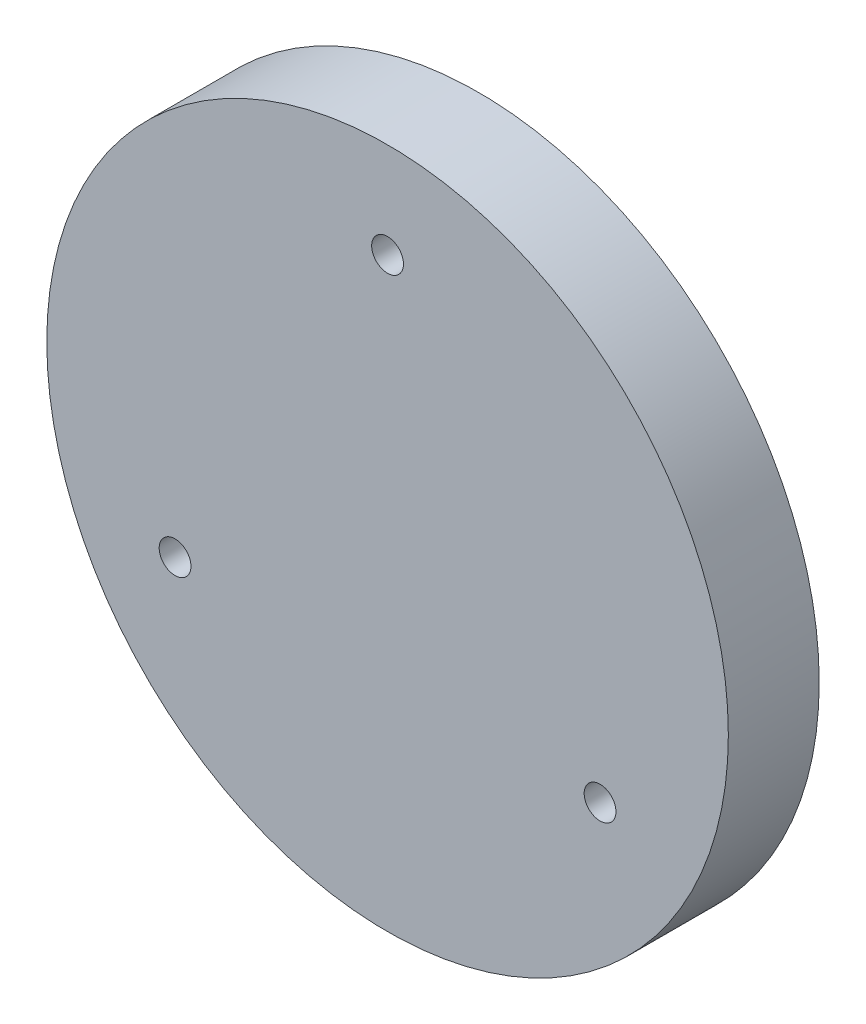
ISO-10303-21;
HEADER;
FILE_DESCRIPTION(('STEP AP214'),'2;1');
FILE_NAME('part.step','',(''),(''),'','','');
FILE_SCHEMA(('AUTOMOTIVE_DESIGN { 1 0 10303 214 1 1 1 1 }'));
ENDSEC;
DATA;
#1=APPLICATION_CONTEXT('core data for automotive mechanical design processes');
#2=APPLICATION_PROTOCOL_DEFINITION('international standard','automotive_design',2000,#1);
#3=PRODUCT_CONTEXT('',#1,'mechanical');
#4=PRODUCT('Part','Part','',(#3));
#5=PRODUCT_RELATED_PRODUCT_CATEGORY('part','',(#4));
#6=PRODUCT_DEFINITION_FORMATION('','',#4);
#7=PRODUCT_DEFINITION_CONTEXT('part definition',#1,'design');
#8=PRODUCT_DEFINITION('design','',#6,#7);
#9=PRODUCT_DEFINITION_SHAPE('','',#8);
#10=(LENGTH_UNIT() NAMED_UNIT(*) SI_UNIT(.MILLI.,.METRE.));
#11=(NAMED_UNIT(*) PLANE_ANGLE_UNIT() SI_UNIT($,.RADIAN.));
#12=(NAMED_UNIT(*) SI_UNIT($,.STERADIAN.) SOLID_ANGLE_UNIT());
#13=UNCERTAINTY_MEASURE_WITH_UNIT(LENGTH_MEASURE(1.E-05),#10,'distance_accuracy_value','');
#14=(GEOMETRIC_REPRESENTATION_CONTEXT(3) GLOBAL_UNCERTAINTY_ASSIGNED_CONTEXT((#13)) GLOBAL_UNIT_ASSIGNED_CONTEXT((#10,
#11,#12)) REPRESENTATION_CONTEXT('',''));
#15=CARTESIAN_POINT('',(0.,0.,0.));
#16=DIRECTION('',(0.,0.,1.));
#17=DIRECTION('',(1.,0.,0.));
#18=AXIS2_PLACEMENT_3D('',#15,#16,#17);
#19=CARTESIAN_POINT('',(0.,0.,10.));
#20=DIRECTION('',(0.,0.,1.));
#21=DIRECTION('',(1.,0.,0.));
#22=AXIS2_PLACEMENT_3D('',#19,#20,#21);
#23=PLANE('',#22);
#24=CARTESIAN_POINT('',(23.3826859021816,-13.499999999999,10.));
#25=DIRECTION('',(0.,0.,1.));
#26=DIRECTION('',(1.,0.,0.));
#27=AXIS2_PLACEMENT_3D('',#24,#25,#26);
#28=CIRCLE('',#27,1.75000000000148);
#29=CARTESIAN_POINT('',(25.132685902183,-13.499999999999,10.));
#30=VERTEX_POINT('',#29);
#31=EDGE_CURVE('E51',#30,#30,#28,.T.);
#32=ORIENTED_EDGE('',*,*,#31,.F.);
#33=EDGE_LOOP('',(#32));
#34=FACE_BOUND('',#33,.T.);
#35=CARTESIAN_POINT('',(0.,0.,10.));
#36=DIRECTION('',(0.,0.,1.));
#37=DIRECTION('',(1.,0.,0.));
#38=AXIS2_PLACEMENT_3D('',#35,#36,#37);
#39=CIRCLE('',#38,37.5);
#40=CARTESIAN_POINT('',(37.5,0.,10.));
#41=VERTEX_POINT('',#40);
#42=EDGE_CURVE('E10',#41,#41,#39,.T.);
#43=ORIENTED_EDGE('',*,*,#42,.T.);
#44=EDGE_LOOP('',(#43));
#45=FACE_BOUND('',#44,.T.);
#46=CARTESIAN_POINT('',(0.,27.,10.));
#47=DIRECTION('',(0.,0.,1.));
#48=DIRECTION('',(1.,0.,0.));
#49=AXIS2_PLACEMENT_3D('',#46,#47,#48);
#50=CIRCLE('',#49,1.75);
#51=CARTESIAN_POINT('',(1.75,27.,10.));
#52=VERTEX_POINT('',#51);
#53=EDGE_CURVE('E46',#52,#52,#50,.T.);
#54=ORIENTED_EDGE('',*,*,#53,.F.);
#55=EDGE_LOOP('',(#54));
#56=FACE_BOUND('',#55,.T.);
#57=CARTESIAN_POINT('',(-23.3826859021781,-13.500000000001,10.));
#58=DIRECTION('',(0.,0.,1.));
#59=DIRECTION('',(1.,0.,0.));
#60=AXIS2_PLACEMENT_3D('',#57,#58,#59);
#61=CIRCLE('',#60,1.75000000000218);
#62=CARTESIAN_POINT('',(-21.6326859021759,-13.500000000001,10.));
#63=VERTEX_POINT('',#62);
#64=EDGE_CURVE('E57',#63,#63,#61,.T.);
#65=ORIENTED_EDGE('',*,*,#64,.F.);
#66=EDGE_LOOP('',(#65));
#67=FACE_BOUND('',#66,.T.);
#68=ADVANCED_FACE('F35',(#34,#45,#56,#67),#23,.T.);
#69=CARTESIAN_POINT('',(0.,0.,0.));
#70=DIRECTION('',(0.,0.,1.));
#71=DIRECTION('',(1.,0.,0.));
#72=AXIS2_PLACEMENT_3D('',#69,#70,#71);
#73=PLANE('',#72);
#74=CARTESIAN_POINT('',(0.,0.,0.));
#75=DIRECTION('',(0.,0.,1.));
#76=DIRECTION('',(1.,0.,0.));
#77=AXIS2_PLACEMENT_3D('',#74,#75,#76);
#78=CIRCLE('',#77,37.5);
#79=CARTESIAN_POINT('',(37.5,0.,0.));
#80=VERTEX_POINT('',#79);
#81=EDGE_CURVE('E39',#80,#80,#78,.T.);
#82=ORIENTED_EDGE('',*,*,#81,.F.);
#83=EDGE_LOOP('',(#82));
#84=FACE_BOUND('',#83,.T.);
#85=CARTESIAN_POINT('',(0.,27.,0.));
#86=DIRECTION('',(0.,0.,1.));
#87=DIRECTION('',(1.,0.,0.));
#88=AXIS2_PLACEMENT_3D('',#85,#86,#87);
#89=CIRCLE('',#88,1.75);
#90=CARTESIAN_POINT('',(1.75,27.,0.));
#91=VERTEX_POINT('',#90);
#92=EDGE_CURVE('E48',#91,#91,#89,.T.);
#93=ORIENTED_EDGE('',*,*,#92,.T.);
#94=EDGE_LOOP('',(#93));
#95=FACE_BOUND('',#94,.T.);
#96=CARTESIAN_POINT('',(23.3826859021816,-13.499999999999,0.));
#97=DIRECTION('',(0.,0.,1.));
#98=DIRECTION('',(1.,0.,0.));
#99=AXIS2_PLACEMENT_3D('',#96,#97,#98);
#100=CIRCLE('',#99,1.75000000000148);
#101=CARTESIAN_POINT('',(25.132685902183,-13.499999999999,0.));
#102=VERTEX_POINT('',#101);
#103=EDGE_CURVE('E54',#102,#102,#100,.T.);
#104=ORIENTED_EDGE('',*,*,#103,.T.);
#105=EDGE_LOOP('',(#104));
#106=FACE_BOUND('',#105,.T.);
#107=CARTESIAN_POINT('',(-23.3826859021781,-13.500000000001,0.));
#108=DIRECTION('',(0.,0.,1.));
#109=DIRECTION('',(1.,0.,0.));
#110=AXIS2_PLACEMENT_3D('',#107,#108,#109);
#111=CIRCLE('',#110,1.75000000000218);
#112=CARTESIAN_POINT('',(-21.6326859021759,-13.500000000001,0.));
#113=VERTEX_POINT('',#112);
#114=EDGE_CURVE('E60',#113,#113,#111,.T.);
#115=ORIENTED_EDGE('',*,*,#114,.T.);
#116=EDGE_LOOP('',(#115));
#117=FACE_BOUND('',#116,.T.);
#118=ADVANCED_FACE('F70',(#84,#95,#106,#117),#73,.F.);
#119=CARTESIAN_POINT('',(0.,0.,10.));
#120=DIRECTION('',(0.,0.,-1.));
#121=DIRECTION('',(-1.,0.,0.));
#122=AXIS2_PLACEMENT_3D('',#119,#120,#121);
#123=CYLINDRICAL_SURFACE('',#122,37.5);
#124=ORIENTED_EDGE('',*,*,#42,.F.);
#125=EDGE_LOOP('',(#124));
#126=FACE_BOUND('',#125,.T.);
#127=ORIENTED_EDGE('',*,*,#81,.T.);
#128=EDGE_LOOP('',(#127));
#129=FACE_BOUND('',#128,.T.);
#130=ADVANCED_FACE('F37',(#126,#129),#123,.T.);
#131=CARTESIAN_POINT('',(0.,27.,10.));
#132=DIRECTION('',(0.,0.,-1.));
#133=DIRECTION('',(-1.,0.,0.));
#134=AXIS2_PLACEMENT_3D('',#131,#132,#133);
#135=CYLINDRICAL_SURFACE('',#134,1.75);
#136=ORIENTED_EDGE('',*,*,#53,.T.);
#137=EDGE_LOOP('',(#136));
#138=FACE_BOUND('',#137,.T.);
#139=ORIENTED_EDGE('',*,*,#92,.F.);
#140=EDGE_LOOP('',(#139));
#141=FACE_BOUND('',#140,.T.);
#142=ADVANCED_FACE('F79',(#138,#141),#135,.F.);
#143=CARTESIAN_POINT('',(23.3826859021816,-13.499999999999,10.));
#144=DIRECTION('',(0.,0.,-1.));
#145=DIRECTION('',(-1.,0.,0.));
#146=AXIS2_PLACEMENT_3D('',#143,#144,#145);
#147=CYLINDRICAL_SURFACE('',#146,1.75000000000148);
#148=ORIENTED_EDGE('',*,*,#31,.T.);
#149=EDGE_LOOP('',(#148));
#150=FACE_BOUND('',#149,.T.);
#151=ORIENTED_EDGE('',*,*,#103,.F.);
#152=EDGE_LOOP('',(#151));
#153=FACE_BOUND('',#152,.T.);
#154=ADVANCED_FACE('F82',(#150,#153),#147,.F.);
#155=CARTESIAN_POINT('',(-23.3826859021781,-13.500000000001,10.));
#156=DIRECTION('',(0.,0.,-1.));
#157=DIRECTION('',(-1.,0.,0.));
#158=AXIS2_PLACEMENT_3D('',#155,#156,#157);
#159=CYLINDRICAL_SURFACE('',#158,1.75000000000218);
#160=ORIENTED_EDGE('',*,*,#64,.T.);
#161=EDGE_LOOP('',(#160));
#162=FACE_BOUND('',#161,.T.);
#163=ORIENTED_EDGE('',*,*,#114,.F.);
#164=EDGE_LOOP('',(#163));
#165=FACE_BOUND('',#164,.T.);
#166=ADVANCED_FACE('F66',(#162,#165),#159,.F.);
#167=CLOSED_SHELL('',(#68,#118,#130,#142,#154,#166));
#168=MANIFOLD_SOLID_BREP('B2',#167);
#169=ADVANCED_BREP_SHAPE_REPRESENTATION('',(#18,#168),#14);
#170=SHAPE_DEFINITION_REPRESENTATION(#9,#169);
ENDSEC;
END-ISO-10303-21;
